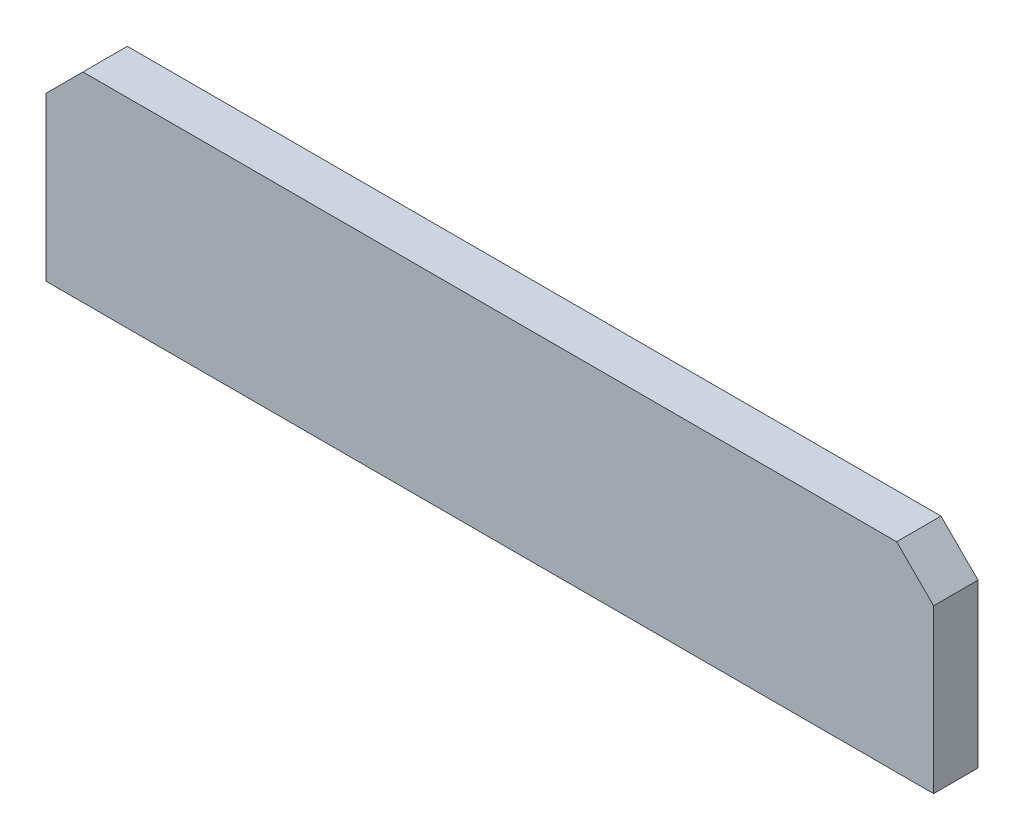
ISO-10303-21;
HEADER;
FILE_DESCRIPTION(('STEP AP214'),'2;1');
FILE_NAME('part.step','',(''),(''),'','','');
FILE_SCHEMA(('AUTOMOTIVE_DESIGN { 1 0 10303 214 1 1 1 1 }'));
ENDSEC;
DATA;
#1=APPLICATION_CONTEXT('core data for automotive mechanical design processes');
#2=APPLICATION_PROTOCOL_DEFINITION('international standard','automotive_design',2000,#1);
#3=PRODUCT_CONTEXT('',#1,'mechanical');
#4=PRODUCT('Part','Part','',(#3));
#5=PRODUCT_RELATED_PRODUCT_CATEGORY('part','',(#4));
#6=PRODUCT_DEFINITION_FORMATION('','',#4);
#7=PRODUCT_DEFINITION_CONTEXT('part definition',#1,'design');
#8=PRODUCT_DEFINITION('design','',#6,#7);
#9=PRODUCT_DEFINITION_SHAPE('','',#8);
#10=(LENGTH_UNIT() NAMED_UNIT(*) SI_UNIT(.MILLI.,.METRE.));
#11=(NAMED_UNIT(*) PLANE_ANGLE_UNIT() SI_UNIT($,.RADIAN.));
#12=(NAMED_UNIT(*) SI_UNIT($,.STERADIAN.) SOLID_ANGLE_UNIT());
#13=UNCERTAINTY_MEASURE_WITH_UNIT(LENGTH_MEASURE(1.E-05),#10,'distance_accuracy_value','');
#14=(GEOMETRIC_REPRESENTATION_CONTEXT(3) GLOBAL_UNCERTAINTY_ASSIGNED_CONTEXT((#13)) GLOBAL_UNIT_ASSIGNED_CONTEXT((#10,
#11,#12)) REPRESENTATION_CONTEXT('',''));
#15=CARTESIAN_POINT('',(0.,0.,0.));
#16=DIRECTION('',(0.,0.,1.));
#17=DIRECTION('',(1.,0.,0.));
#18=AXIS2_PLACEMENT_3D('',#15,#16,#17);
#19=CARTESIAN_POINT('',(60.,-13.5,6.));
#20=DIRECTION('',(-1.,0.,0.));
#21=DIRECTION('',(0.,0.,1.));
#22=AXIS2_PLACEMENT_3D('',#19,#20,#21);
#23=PLANE('',#22);
#24=DIRECTION('',(0.,1.,0.));
#25=VECTOR('',#24,1.);
#26=CARTESIAN_POINT('',(60.,-13.5,0.));
#27=LINE('',#26,#25);
#28=CARTESIAN_POINT('',(60.,-13.5,0.));
#29=VERTEX_POINT('',#28);
#30=CARTESIAN_POINT('',(60.,8.49999999999997,0.));
#31=VERTEX_POINT('',#30);
#32=EDGE_CURVE('E116',#29,#31,#27,.T.);
#33=ORIENTED_EDGE('',*,*,#32,.T.);
#34=DIRECTION('',(0.,0.,1.));
#35=VECTOR('',#34,1.);
#36=CARTESIAN_POINT('',(60.,8.49999999999997,6.));
#37=LINE('',#36,#35);
#38=CARTESIAN_POINT('',(60.,8.49999999999997,6.));
#39=VERTEX_POINT('',#38);
#40=EDGE_CURVE('E11',#31,#39,#37,.T.);
#41=ORIENTED_EDGE('',*,*,#40,.T.);
#42=DIRECTION('',(0.,1.,0.));
#43=VECTOR('',#42,1.);
#44=CARTESIAN_POINT('',(60.,-13.5,6.));
#45=LINE('',#44,#43);
#46=CARTESIAN_POINT('',(60.,-13.5,6.));
#47=VERTEX_POINT('',#46);
#48=EDGE_CURVE('E122',#47,#39,#45,.T.);
#49=ORIENTED_EDGE('',*,*,#48,.F.);
#50=DIRECTION('',(0.,0.,-1.));
#51=VECTOR('',#50,1.);
#52=CARTESIAN_POINT('',(60.,-13.5,6.));
#53=LINE('',#52,#51);
#54=EDGE_CURVE('E108',#47,#29,#53,.T.);
#55=ORIENTED_EDGE('',*,*,#54,.T.);
#56=EDGE_LOOP('',(#33,#41,#49,#55));
#57=FACE_BOUND('',#56,.T.);
#58=ADVANCED_FACE('F34',(#57),#23,.F.);
#59=CARTESIAN_POINT('',(-60.,13.5,6.));
#60=DIRECTION('',(0.,-1.,0.));
#61=DIRECTION('',(0.,0.,-1.));
#62=AXIS2_PLACEMENT_3D('',#59,#60,#61);
#63=PLANE('',#62);
#64=DIRECTION('',(-1.,0.,0.));
#65=VECTOR('',#64,1.);
#66=CARTESIAN_POINT('',(-60.,13.5,0.));
#67=LINE('',#66,#65);
#68=CARTESIAN_POINT('',(55.,13.5,0.));
#69=VERTEX_POINT('',#68);
#70=CARTESIAN_POINT('',(-55.,13.5,0.));
#71=VERTEX_POINT('',#70);
#72=EDGE_CURVE('E118',#69,#71,#67,.T.);
#73=ORIENTED_EDGE('',*,*,#72,.T.);
#74=DIRECTION('',(0.,0.,1.));
#75=VECTOR('',#74,1.);
#76=CARTESIAN_POINT('',(-55.,13.5,6.));
#77=LINE('',#76,#75);
#78=CARTESIAN_POINT('',(-55.,13.5,6.));
#79=VERTEX_POINT('',#78);
#80=EDGE_CURVE('E55',#71,#79,#77,.T.);
#81=ORIENTED_EDGE('',*,*,#80,.T.);
#82=DIRECTION('',(-1.,0.,0.));
#83=VECTOR('',#82,1.);
#84=CARTESIAN_POINT('',(-60.,13.5,6.));
#85=LINE('',#84,#83);
#86=CARTESIAN_POINT('',(55.,13.5,6.));
#87=VERTEX_POINT('',#86);
#88=EDGE_CURVE('E98',#87,#79,#85,.T.);
#89=ORIENTED_EDGE('',*,*,#88,.F.);
#90=DIRECTION('',(0.,0.,-1.));
#91=VECTOR('',#90,1.);
#92=CARTESIAN_POINT('',(55.,13.5,6.));
#93=LINE('',#92,#91);
#94=EDGE_CURVE('E129',#87,#69,#93,.T.);
#95=ORIENTED_EDGE('',*,*,#94,.T.);
#96=EDGE_LOOP('',(#73,#81,#89,#95));
#97=FACE_BOUND('',#96,.T.);
#98=ADVANCED_FACE('F137',(#97),#63,.F.);
#99=CARTESIAN_POINT('',(-60.,-13.5,6.));
#100=DIRECTION('',(1.,0.,0.));
#101=DIRECTION('',(0.,0.,-1.));
#102=AXIS2_PLACEMENT_3D('',#99,#100,#101);
#103=PLANE('',#102);
#104=DIRECTION('',(0.,-1.,0.));
#105=VECTOR('',#104,1.);
#106=CARTESIAN_POINT('',(-60.,-13.5,6.));
#107=LINE('',#106,#105);
#108=CARTESIAN_POINT('',(-60.,8.50000000000001,6.));
#109=VERTEX_POINT('',#108);
#110=CARTESIAN_POINT('',(-60.,-13.5,6.));
#111=VERTEX_POINT('',#110);
#112=EDGE_CURVE('E88',#109,#111,#107,.T.);
#113=ORIENTED_EDGE('',*,*,#112,.F.);
#114=DIRECTION('',(0.,0.,-1.));
#115=VECTOR('',#114,1.);
#116=CARTESIAN_POINT('',(-60.,8.50000000000001,6.));
#117=LINE('',#116,#115);
#118=CARTESIAN_POINT('',(-60.,8.50000000000001,0.));
#119=VERTEX_POINT('',#118);
#120=EDGE_CURVE('E107',#109,#119,#117,.T.);
#121=ORIENTED_EDGE('',*,*,#120,.T.);
#122=DIRECTION('',(0.,-1.,0.));
#123=VECTOR('',#122,1.);
#124=CARTESIAN_POINT('',(-60.,-13.5,0.));
#125=LINE('',#124,#123);
#126=CARTESIAN_POINT('',(-60.,-13.5,0.));
#127=VERTEX_POINT('',#126);
#128=EDGE_CURVE('E104',#119,#127,#125,.T.);
#129=ORIENTED_EDGE('',*,*,#128,.T.);
#130=DIRECTION('',(0.,0.,-1.));
#131=VECTOR('',#130,1.);
#132=CARTESIAN_POINT('',(-60.,-13.5,6.));
#133=LINE('',#132,#131);
#134=EDGE_CURVE('E101',#111,#127,#133,.T.);
#135=ORIENTED_EDGE('',*,*,#134,.F.);
#136=EDGE_LOOP('',(#113,#121,#129,#135));
#137=FACE_BOUND('',#136,.T.);
#138=ADVANCED_FACE('F102',(#137),#103,.F.);
#139=CARTESIAN_POINT('',(-60.,-13.5,6.));
#140=DIRECTION('',(0.,1.,0.));
#141=DIRECTION('',(0.,0.,1.));
#142=AXIS2_PLACEMENT_3D('',#139,#140,#141);
#143=PLANE('',#142);
#144=DIRECTION('',(1.,0.,0.));
#145=VECTOR('',#144,1.);
#146=CARTESIAN_POINT('',(-60.,-13.5,0.));
#147=LINE('',#146,#145);
#148=EDGE_CURVE('E121',#127,#29,#147,.T.);
#149=ORIENTED_EDGE('',*,*,#148,.T.);
#150=ORIENTED_EDGE('',*,*,#54,.F.);
#151=DIRECTION('',(1.,0.,0.));
#152=VECTOR('',#151,1.);
#153=CARTESIAN_POINT('',(-60.,-13.5,6.));
#154=LINE('',#153,#152);
#155=EDGE_CURVE('E92',#111,#47,#154,.T.);
#156=ORIENTED_EDGE('',*,*,#155,.F.);
#157=ORIENTED_EDGE('',*,*,#134,.T.);
#158=EDGE_LOOP('',(#149,#150,#156,#157));
#159=FACE_BOUND('',#158,.T.);
#160=ADVANCED_FACE('F110',(#159),#143,.F.);
#161=CARTESIAN_POINT('',(0.,0.,6.));
#162=DIRECTION('',(0.,0.,-1.));
#163=DIRECTION('',(-1.,0.,0.));
#164=AXIS2_PLACEMENT_3D('',#161,#162,#163);
#165=PLANE('',#164);
#166=ORIENTED_EDGE('',*,*,#88,.T.);
#167=DIRECTION('',(0.707106781186549,0.707106781186547,0.));
#168=VECTOR('',#167,1.);
#169=CARTESIAN_POINT('',(-60.,8.50000000000001,6.));
#170=LINE('',#169,#168);
#171=EDGE_CURVE('E42',#79,#109,#170,.F.);
#172=ORIENTED_EDGE('',*,*,#171,.T.);
#173=ORIENTED_EDGE('',*,*,#112,.T.);
#174=ORIENTED_EDGE('',*,*,#155,.T.);
#175=ORIENTED_EDGE('',*,*,#48,.T.);
#176=DIRECTION('',(0.707106781186546,-0.707106781186549,0.));
#177=VECTOR('',#176,1.);
#178=CARTESIAN_POINT('',(55.,13.5,6.));
#179=LINE('',#178,#177);
#180=EDGE_CURVE('E133',#39,#87,#179,.F.);
#181=ORIENTED_EDGE('',*,*,#180,.T.);
#182=EDGE_LOOP('',(#166,#172,#173,#174,#175,#181));
#183=FACE_BOUND('',#182,.T.);
#184=ADVANCED_FACE('F90',(#183),#165,.F.);
#185=CARTESIAN_POINT('',(0.,0.,0.));
#186=DIRECTION('',(0.,0.,-1.));
#187=DIRECTION('',(-1.,0.,0.));
#188=AXIS2_PLACEMENT_3D('',#185,#186,#187);
#189=PLANE('',#188);
#190=ORIENTED_EDGE('',*,*,#128,.F.);
#191=DIRECTION('',(-0.707106781186549,-0.707106781186547,0.));
#192=VECTOR('',#191,1.);
#193=CARTESIAN_POINT('',(-34.2499999999999,34.25,0.));
#194=LINE('',#193,#192);
#195=EDGE_CURVE('E127',#119,#71,#194,.F.);
#196=ORIENTED_EDGE('',*,*,#195,.T.);
#197=ORIENTED_EDGE('',*,*,#72,.F.);
#198=DIRECTION('',(-0.707106781186546,0.707106781186549,0.));
#199=VECTOR('',#198,1.);
#200=CARTESIAN_POINT('',(34.2500000000002,34.25,0.));
#201=LINE('',#200,#199);
#202=EDGE_CURVE('E125',#69,#31,#201,.F.);
#203=ORIENTED_EDGE('',*,*,#202,.T.);
#204=ORIENTED_EDGE('',*,*,#32,.F.);
#205=ORIENTED_EDGE('',*,*,#148,.F.);
#206=EDGE_LOOP('',(#190,#196,#197,#203,#204,#205));
#207=FACE_BOUND('',#206,.T.);
#208=ADVANCED_FACE('F141',(#207),#189,.T.);
#209=CARTESIAN_POINT('',(-60.,8.50000000000001,6.));
#210=DIRECTION('',(0.707106781186546,-0.707106781186548,0.));
#211=DIRECTION('',(0.,0.,-1.));
#212=AXIS2_PLACEMENT_3D('',#209,#210,#211);
#213=PLANE('',#212);
#214=ORIENTED_EDGE('',*,*,#171,.F.);
#215=ORIENTED_EDGE('',*,*,#80,.F.);
#216=ORIENTED_EDGE('',*,*,#195,.F.);
#217=ORIENTED_EDGE('',*,*,#120,.F.);
#218=EDGE_LOOP('',(#214,#215,#216,#217));
#219=FACE_BOUND('',#218,.T.);
#220=ADVANCED_FACE('F150',(#219),#213,.F.);
#221=CARTESIAN_POINT('',(55.,13.5,6.));
#222=DIRECTION('',(-0.707106781186549,-0.707106781186545,0.));
#223=DIRECTION('',(0.,0.,-1.));
#224=AXIS2_PLACEMENT_3D('',#221,#222,#223);
#225=PLANE('',#224);
#226=ORIENTED_EDGE('',*,*,#180,.F.);
#227=ORIENTED_EDGE('',*,*,#40,.F.);
#228=ORIENTED_EDGE('',*,*,#202,.F.);
#229=ORIENTED_EDGE('',*,*,#94,.F.);
#230=EDGE_LOOP('',(#226,#227,#228,#229));
#231=FACE_BOUND('',#230,.T.);
#232=ADVANCED_FACE('F36',(#231),#225,.F.);
#233=CLOSED_SHELL('',(#58,#98,#138,#160,#184,#208,#220,#232));
#234=MANIFOLD_SOLID_BREP('B2',#233);
#235=ADVANCED_BREP_SHAPE_REPRESENTATION('',(#18,#234),#14);
#236=SHAPE_DEFINITION_REPRESENTATION(#9,#235);
ENDSEC;
END-ISO-10303-21;
